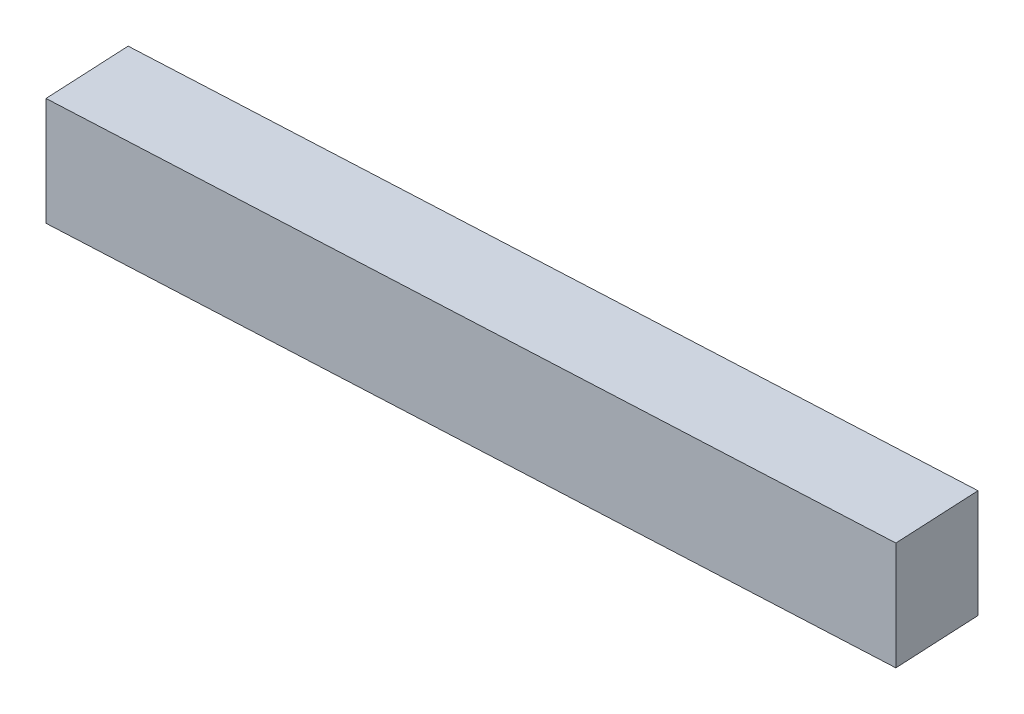
ISO-10303-21;
HEADER;
FILE_DESCRIPTION(('STEP AP214'),'2;1');
FILE_NAME('part.step','',(''),(''),'','','');
FILE_SCHEMA(('AUTOMOTIVE_DESIGN { 1 0 10303 214 1 1 1 1 }'));
ENDSEC;
DATA;
#1=APPLICATION_CONTEXT('core data for automotive mechanical design processes');
#2=APPLICATION_PROTOCOL_DEFINITION('international standard','automotive_design',2000,#1);
#3=PRODUCT_CONTEXT('',#1,'mechanical');
#4=PRODUCT('Part','Part','',(#3));
#5=PRODUCT_RELATED_PRODUCT_CATEGORY('part','',(#4));
#6=PRODUCT_DEFINITION_FORMATION('','',#4);
#7=PRODUCT_DEFINITION_CONTEXT('part definition',#1,'design');
#8=PRODUCT_DEFINITION('design','',#6,#7);
#9=PRODUCT_DEFINITION_SHAPE('','',#8);
#10=(LENGTH_UNIT() NAMED_UNIT(*) SI_UNIT(.MILLI.,.METRE.));
#11=(NAMED_UNIT(*) PLANE_ANGLE_UNIT() SI_UNIT($,.RADIAN.));
#12=(NAMED_UNIT(*) SI_UNIT($,.STERADIAN.) SOLID_ANGLE_UNIT());
#13=UNCERTAINTY_MEASURE_WITH_UNIT(LENGTH_MEASURE(1.E-05),#10,'distance_accuracy_value','');
#14=(GEOMETRIC_REPRESENTATION_CONTEXT(3) GLOBAL_UNCERTAINTY_ASSIGNED_CONTEXT((#13)) GLOBAL_UNIT_ASSIGNED_CONTEXT((#10,
#11,#12)) REPRESENTATION_CONTEXT('',''));
#15=CARTESIAN_POINT('',(0.,0.,0.));
#16=DIRECTION('',(0.,0.,1.));
#17=DIRECTION('',(1.,0.,0.));
#18=AXIS2_PLACEMENT_3D('',#15,#16,#17);
#19=CARTESIAN_POINT('',(17.9712972285213,7.874,-0.986270726498209));
#20=DIRECTION('',(0.0492216587907372,0.,0.998787879534933));
#21=DIRECTION('',(0.998787879534933,0.,-0.0492216587907372));
#22=AXIS2_PLACEMENT_3D('',#19,#20,#21);
#23=PLANE('',#22);
#24=DIRECTION('',(0.,1.,0.));
#25=VECTOR('',#24,1.);
#26=CARTESIAN_POINT('',(17.9712972285213,7.874,-0.986270726498209));
#27=LINE('',#26,#25);
#28=CARTESIAN_POINT('',(17.9712972285213,7.62,-0.986270726498209));
#29=VERTEX_POINT('',#28);
#30=CARTESIAN_POINT('',(17.9712972285213,7.874,-0.986270726498209));
#31=VERTEX_POINT('',#30);
#32=EDGE_CURVE('E20',#29,#31,#27,.T.);
#33=ORIENTED_EDGE('',*,*,#32,.T.);
#34=DIRECTION('',(0.998787879534933,0.,-0.0492216587907341));
#35=VECTOR('',#34,1.);
#36=CARTESIAN_POINT('',(17.9712972285213,7.874,-0.986270726498209));
#37=LINE('',#36,#35);
#38=CARTESIAN_POINT('',(19.8739881390354,7.874,-1.08003798649456));
#39=VERTEX_POINT('',#38);
#40=EDGE_CURVE('E55',#31,#39,#37,.T.);
#41=ORIENTED_EDGE('',*,*,#40,.T.);
#42=DIRECTION('',(0.,1.,0.));
#43=VECTOR('',#42,1.);
#44=CARTESIAN_POINT('',(19.8739881390354,7.874,-1.08003798649456));
#45=LINE('',#44,#43);
#46=CARTESIAN_POINT('',(19.8739881390354,7.62,-1.08003798649456));
#47=VERTEX_POINT('',#46);
#48=EDGE_CURVE('E76',#39,#47,#45,.F.);
#49=ORIENTED_EDGE('',*,*,#48,.T.);
#50=DIRECTION('',(0.998787879534933,0.,-0.0492216587907341));
#51=VECTOR('',#50,1.);
#52=CARTESIAN_POINT('',(17.9712972285213,7.62,-0.986270726498209));
#53=LINE('',#52,#51);
#54=EDGE_CURVE('E58',#29,#47,#53,.T.);
#55=ORIENTED_EDGE('',*,*,#54,.F.);
#56=EDGE_LOOP('',(#33,#41,#49,#55));
#57=FACE_BOUND('',#56,.T.);
#58=ADVANCED_FACE('F17',(#57),#23,.F.);
#59=CARTESIAN_POINT('',(17.9712972285213,7.874,-0.986270726498209));
#60=DIRECTION('',(0.998787879534934,0.,-0.0492216587907212));
#61=DIRECTION('',(-0.0492216587907212,0.,-0.998787879534934));
#62=AXIS2_PLACEMENT_3D('',#59,#60,#61);
#63=PLANE('',#62);
#64=DIRECTION('',(0.,1.,0.));
#65=VECTOR('',#64,1.);
#66=CARTESIAN_POINT('',(17.9812990695876,7.874,-0.783317029376707));
#67=LINE('',#66,#65);
#68=CARTESIAN_POINT('',(17.9812990695876,7.62,-0.783317029376707));
#69=VERTEX_POINT('',#68);
#70=CARTESIAN_POINT('',(17.9812990695876,7.874,-0.783317029376707));
#71=VERTEX_POINT('',#70);
#72=EDGE_CURVE('E73',#69,#71,#67,.T.);
#73=ORIENTED_EDGE('',*,*,#72,.T.);
#74=DIRECTION('',(-0.0492216587908234,0.,-0.998787879534929));
#75=VECTOR('',#74,1.);
#76=CARTESIAN_POINT('',(17.9812990695876,7.874,-0.783317029376707));
#77=LINE('',#76,#75);
#78=EDGE_CURVE('E63',#71,#31,#77,.T.);
#79=ORIENTED_EDGE('',*,*,#78,.T.);
#80=ORIENTED_EDGE('',*,*,#32,.F.);
#81=DIRECTION('',(-0.0492216587908234,0.,-0.998787879534929));
#82=VECTOR('',#81,1.);
#83=CARTESIAN_POINT('',(17.9812990695876,7.62,-0.783317029376707));
#84=LINE('',#83,#82);
#85=EDGE_CURVE('E80',#69,#29,#84,.T.);
#86=ORIENTED_EDGE('',*,*,#85,.F.);
#87=EDGE_LOOP('',(#73,#79,#80,#86));
#88=FACE_BOUND('',#87,.T.);
#89=ADVANCED_FACE('F72',(#88),#63,.F.);
#90=CARTESIAN_POINT('',(17.9712972285213,7.874,-0.986270726498209));
#91=DIRECTION('',(0.,-1.,0.));
#92=DIRECTION('',(0.,0.,-1.));
#93=AXIS2_PLACEMENT_3D('',#90,#91,#92);
#94=PLANE('',#93);
#95=ORIENTED_EDGE('',*,*,#78,.F.);
#96=DIRECTION('',(-0.998787879534933,0.,0.0492216587907362));
#97=VECTOR('',#96,1.);
#98=CARTESIAN_POINT('',(17.9812990695876,7.874,-0.783317029376707));
#99=LINE('',#98,#97);
#100=CARTESIAN_POINT('',(19.8839899804106,7.874,-0.877084289388286));
#101=VERTEX_POINT('',#100);
#102=EDGE_CURVE('E83',#71,#101,#99,.F.);
#103=ORIENTED_EDGE('',*,*,#102,.T.);
#104=DIRECTION('',(0.0492216603112332,0.,0.998787879460001));
#105=VECTOR('',#104,1.);
#106=CARTESIAN_POINT('',(19.8739881390354,7.874,-1.08003798649456));
#107=LINE('',#106,#105);
#108=EDGE_CURVE('E69',#101,#39,#107,.F.);
#109=ORIENTED_EDGE('',*,*,#108,.T.);
#110=ORIENTED_EDGE('',*,*,#40,.F.);
#111=EDGE_LOOP('',(#95,#103,#109,#110));
#112=FACE_BOUND('',#111,.T.);
#113=ADVANCED_FACE('F66',(#112),#94,.F.);
#114=CARTESIAN_POINT('',(19.8739881390354,7.874,-1.08003798649456));
#115=DIRECTION('',(-0.998787879460001,0.,0.0492216603112332));
#116=DIRECTION('',(0.0492216603112332,0.,0.998787879460001));
#117=AXIS2_PLACEMENT_3D('',#114,#115,#116);
#118=PLANE('',#117);
#119=ORIENTED_EDGE('',*,*,#48,.F.);
#120=ORIENTED_EDGE('',*,*,#108,.F.);
#121=DIRECTION('',(0.,1.,0.));
#122=VECTOR('',#121,1.);
#123=CARTESIAN_POINT('',(19.8839899804106,7.874,-0.877084289388285));
#124=LINE('',#123,#122);
#125=CARTESIAN_POINT('',(19.8839899804106,7.62,-0.877084289388286));
#126=VERTEX_POINT('',#125);
#127=EDGE_CURVE('E26',#101,#126,#124,.F.);
#128=ORIENTED_EDGE('',*,*,#127,.T.);
#129=DIRECTION('',(0.0492216603110294,0.,0.998787879460011));
#130=VECTOR('',#129,1.);
#131=CARTESIAN_POINT('',(19.8739881390354,7.62,-1.08003798649456));
#132=LINE('',#131,#130);
#133=EDGE_CURVE('E34',#47,#126,#132,.T.);
#134=ORIENTED_EDGE('',*,*,#133,.F.);
#135=EDGE_LOOP('',(#119,#120,#128,#134));
#136=FACE_BOUND('',#135,.T.);
#137=ADVANCED_FACE('F88',(#136),#118,.F.);
#138=CARTESIAN_POINT('',(17.9712972285213,7.62,-0.986270726498209));
#139=DIRECTION('',(0.,-1.,0.));
#140=DIRECTION('',(0.,0.,-1.));
#141=AXIS2_PLACEMENT_3D('',#138,#139,#140);
#142=PLANE('',#141);
#143=DIRECTION('',(-0.998787879534933,0.,0.0492216587907362));
#144=VECTOR('',#143,1.);
#145=CARTESIAN_POINT('',(17.9812990695876,7.62,-0.783317029376707));
#146=LINE('',#145,#144);
#147=EDGE_CURVE('E11',#126,#69,#146,.T.);
#148=ORIENTED_EDGE('',*,*,#147,.T.);
#149=ORIENTED_EDGE('',*,*,#85,.T.);
#150=ORIENTED_EDGE('',*,*,#54,.T.);
#151=ORIENTED_EDGE('',*,*,#133,.T.);
#152=EDGE_LOOP('',(#148,#149,#150,#151));
#153=FACE_BOUND('',#152,.T.);
#154=ADVANCED_FACE('F91',(#153),#142,.T.);
#155=CARTESIAN_POINT('',(17.9812990695876,7.874,-0.783317029376707));
#156=DIRECTION('',(-0.0492216587907362,0.,-0.998787879534933));
#157=DIRECTION('',(-0.998787879534933,0.,0.0492216587907362));
#158=AXIS2_PLACEMENT_3D('',#155,#156,#157);
#159=PLANE('',#158);
#160=ORIENTED_EDGE('',*,*,#127,.F.);
#161=ORIENTED_EDGE('',*,*,#102,.F.);
#162=ORIENTED_EDGE('',*,*,#72,.F.);
#163=ORIENTED_EDGE('',*,*,#147,.F.);
#164=EDGE_LOOP('',(#160,#161,#162,#163));
#165=FACE_BOUND('',#164,.T.);
#166=ADVANCED_FACE('F90',(#165),#159,.F.);
#167=CLOSED_SHELL('',(#58,#89,#113,#137,#154,#166));
#168=MANIFOLD_SOLID_BREP('B1',#167);
#169=ADVANCED_BREP_SHAPE_REPRESENTATION('',(#18,#168),#14);
#170=SHAPE_DEFINITION_REPRESENTATION(#9,#169);
ENDSEC;
END-ISO-10303-21;
